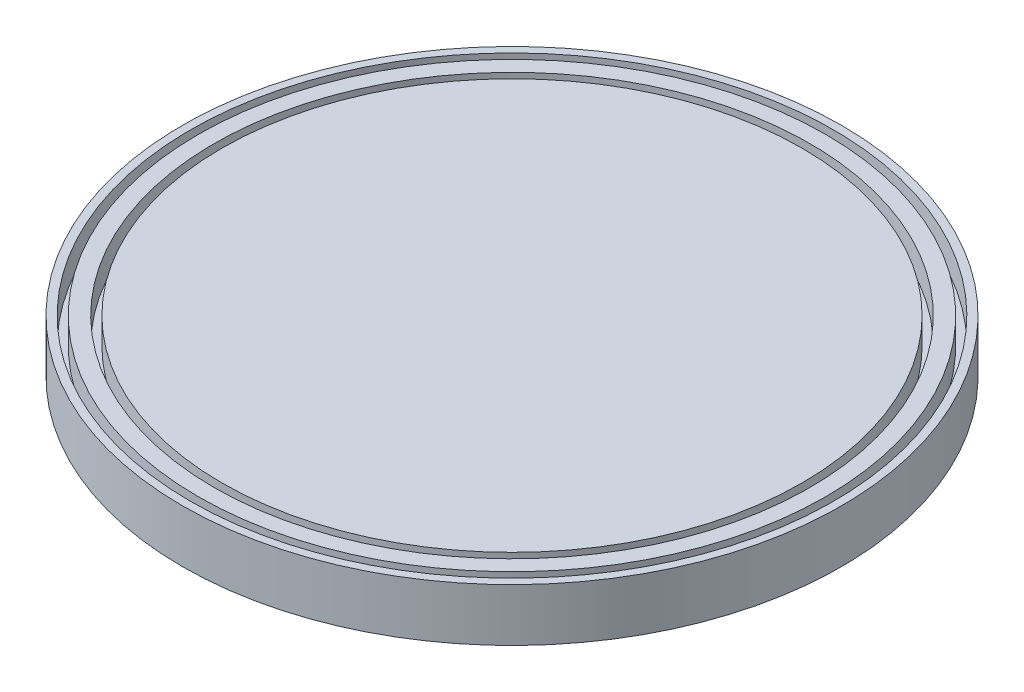
ISO-10303-21;
HEADER;
FILE_DESCRIPTION(('STEP AP214'),'2;1');
FILE_NAME('part.step','',(''),(''),'','','');
FILE_SCHEMA(('AUTOMOTIVE_DESIGN { 1 0 10303 214 1 1 1 1 }'));
ENDSEC;
DATA;
#1=APPLICATION_CONTEXT('core data for automotive mechanical design processes');
#2=APPLICATION_PROTOCOL_DEFINITION('international standard','automotive_design',2000,#1);
#3=PRODUCT_CONTEXT('',#1,'mechanical');
#4=PRODUCT('Part','Part','',(#3));
#5=PRODUCT_RELATED_PRODUCT_CATEGORY('part','',(#4));
#6=PRODUCT_DEFINITION_FORMATION('','',#4);
#7=PRODUCT_DEFINITION_CONTEXT('part definition',#1,'design');
#8=PRODUCT_DEFINITION('design','',#6,#7);
#9=PRODUCT_DEFINITION_SHAPE('','',#8);
#10=(LENGTH_UNIT() NAMED_UNIT(*) SI_UNIT(.MILLI.,.METRE.));
#11=(NAMED_UNIT(*) PLANE_ANGLE_UNIT() SI_UNIT($,.RADIAN.));
#12=(NAMED_UNIT(*) SI_UNIT($,.STERADIAN.) SOLID_ANGLE_UNIT());
#13=UNCERTAINTY_MEASURE_WITH_UNIT(LENGTH_MEASURE(1.E-05),#10,'distance_accuracy_value','');
#14=(GEOMETRIC_REPRESENTATION_CONTEXT(3) GLOBAL_UNCERTAINTY_ASSIGNED_CONTEXT((#13)) GLOBAL_UNIT_ASSIGNED_CONTEXT((#10,
#11,#12)) REPRESENTATION_CONTEXT('',''));
#15=CARTESIAN_POINT('',(0.,0.,0.));
#16=DIRECTION('',(0.,0.,1.));
#17=DIRECTION('',(1.,0.,0.));
#18=AXIS2_PLACEMENT_3D('',#15,#16,#17);
#19=CARTESIAN_POINT('',(0.,10.,0.));
#20=DIRECTION('',(0.,-1.,0.));
#21=DIRECTION('',(0.,0.,-1.));
#22=AXIS2_PLACEMENT_3D('',#19,#20,#21);
#23=CYLINDRICAL_SURFACE('',#22,62.5);
#24=CARTESIAN_POINT('',(0.,10.,0.));
#25=DIRECTION('',(0.,1.,0.));
#26=DIRECTION('',(0.,0.,1.));
#27=AXIS2_PLACEMENT_3D('',#24,#25,#26);
#28=CIRCLE('',#27,62.5);
#29=CARTESIAN_POINT('',(0.,10.,62.5));
#30=VERTEX_POINT('',#29);
#31=EDGE_CURVE('E11',#30,#30,#28,.T.);
#32=ORIENTED_EDGE('',*,*,#31,.F.);
#33=EDGE_LOOP('',(#32));
#34=FACE_BOUND('',#33,.T.);
#35=CARTESIAN_POINT('',(0.,0.,0.));
#36=DIRECTION('',(0.,1.,0.));
#37=DIRECTION('',(0.,0.,1.));
#38=AXIS2_PLACEMENT_3D('',#35,#36,#37);
#39=CIRCLE('',#38,62.5);
#40=CARTESIAN_POINT('',(0.,0.,62.5));
#41=VERTEX_POINT('',#40);
#42=EDGE_CURVE('E42',#41,#41,#39,.T.);
#43=ORIENTED_EDGE('',*,*,#42,.T.);
#44=EDGE_LOOP('',(#43));
#45=FACE_BOUND('',#44,.T.);
#46=ADVANCED_FACE('F39',(#34,#45),#23,.T.);
#47=CARTESIAN_POINT('',(0.,10.,0.));
#48=DIRECTION('',(0.,1.,0.));
#49=DIRECTION('',(0.,0.,1.));
#50=AXIS2_PLACEMENT_3D('',#47,#48,#49);
#51=PLANE('',#50);
#52=CARTESIAN_POINT('',(0.,10.,0.));
#53=DIRECTION('',(0.,1.,0.));
#54=DIRECTION('',(0.,0.,1.));
#55=AXIS2_PLACEMENT_3D('',#52,#53,#54);
#56=CIRCLE('',#55,61.);
#57=CARTESIAN_POINT('',(0.,10.,61.));
#58=VERTEX_POINT('',#57);
#59=EDGE_CURVE('E63',#58,#58,#56,.T.);
#60=ORIENTED_EDGE('',*,*,#59,.F.);
#61=EDGE_LOOP('',(#60));
#62=FACE_BOUND('',#61,.T.);
#63=ORIENTED_EDGE('',*,*,#31,.T.);
#64=EDGE_LOOP('',(#63));
#65=FACE_BOUND('',#64,.T.);
#66=ADVANCED_FACE('F91',(#62,#65),#51,.T.);
#67=CARTESIAN_POINT('',(0.,0.,0.));
#68=DIRECTION('',(0.,1.,0.));
#69=DIRECTION('',(0.,0.,1.));
#70=AXIS2_PLACEMENT_3D('',#67,#68,#69);
#71=PLANE('',#70);
#72=ORIENTED_EDGE('',*,*,#42,.F.);
#73=EDGE_LOOP('',(#72));
#74=FACE_BOUND('',#73,.T.);
#75=ADVANCED_FACE('F93',(#74),#71,.F.);
#76=CARTESIAN_POINT('',(0.,5.,0.));
#77=DIRECTION('',(0.,1.,0.));
#78=DIRECTION('',(0.,0.,1.));
#79=AXIS2_PLACEMENT_3D('',#76,#77,#78);
#80=CYLINDRICAL_SURFACE('',#79,59.5);
#81=CARTESIAN_POINT('',(0.,5.,0.));
#82=DIRECTION('',(0.,1.,0.));
#83=DIRECTION('',(0.,0.,1.));
#84=AXIS2_PLACEMENT_3D('',#81,#82,#83);
#85=CIRCLE('',#84,59.5);
#86=CARTESIAN_POINT('',(0.,5.,59.5));
#87=VERTEX_POINT('',#86);
#88=EDGE_CURVE('E66',#87,#87,#85,.T.);
#89=ORIENTED_EDGE('',*,*,#88,.T.);
#90=EDGE_LOOP('',(#89));
#91=FACE_BOUND('',#90,.T.);
#92=CARTESIAN_POINT('',(0.,10.,0.));
#93=DIRECTION('',(0.,1.,0.));
#94=DIRECTION('',(0.,0.,1.));
#95=AXIS2_PLACEMENT_3D('',#92,#93,#94);
#96=CIRCLE('',#95,59.5);
#97=CARTESIAN_POINT('',(0.,10.,59.5));
#98=VERTEX_POINT('',#97);
#99=EDGE_CURVE('E67',#98,#98,#96,.T.);
#100=ORIENTED_EDGE('',*,*,#99,.F.);
#101=EDGE_LOOP('',(#100));
#102=FACE_BOUND('',#101,.T.);
#103=ADVANCED_FACE('F75',(#91,#102),#80,.T.);
#104=CARTESIAN_POINT('',(0.,5.,0.));
#105=DIRECTION('',(0.,1.,0.));
#106=DIRECTION('',(0.,0.,1.));
#107=AXIS2_PLACEMENT_3D('',#104,#105,#106);
#108=CYLINDRICAL_SURFACE('',#107,61.);
#109=CARTESIAN_POINT('',(0.,5.,0.));
#110=DIRECTION('',(0.,1.,0.));
#111=DIRECTION('',(0.,0.,1.));
#112=AXIS2_PLACEMENT_3D('',#109,#110,#111);
#113=CIRCLE('',#112,61.);
#114=CARTESIAN_POINT('',(0.,5.,61.));
#115=VERTEX_POINT('',#114);
#116=EDGE_CURVE('E58',#115,#115,#113,.T.);
#117=ORIENTED_EDGE('',*,*,#116,.F.);
#118=EDGE_LOOP('',(#117));
#119=FACE_BOUND('',#118,.T.);
#120=ORIENTED_EDGE('',*,*,#59,.T.);
#121=EDGE_LOOP('',(#120));
#122=FACE_BOUND('',#121,.T.);
#123=ADVANCED_FACE('F82',(#119,#122),#108,.F.);
#124=CARTESIAN_POINT('',(0.,5.,0.));
#125=DIRECTION('',(0.,1.,0.));
#126=DIRECTION('',(0.,0.,1.));
#127=AXIS2_PLACEMENT_3D('',#124,#125,#126);
#128=PLANE('',#127);
#129=ORIENTED_EDGE('',*,*,#88,.F.);
#130=EDGE_LOOP('',(#129));
#131=FACE_BOUND('',#130,.T.);
#132=ORIENTED_EDGE('',*,*,#116,.T.);
#133=EDGE_LOOP('',(#132));
#134=FACE_BOUND('',#133,.T.);
#135=ADVANCED_FACE('F78',(#131,#134),#128,.T.);
#136=CARTESIAN_POINT('',(0.,10.,0.));
#137=DIRECTION('',(0.,1.,0.));
#138=DIRECTION('',(0.,0.,1.));
#139=AXIS2_PLACEMENT_3D('',#136,#137,#138);
#140=CIRCLE('',#139,56.5);
#141=CARTESIAN_POINT('',(0.,10.,56.5));
#142=VERTEX_POINT('',#141);
#143=EDGE_CURVE('E51',#142,#142,#140,.T.);
#144=ORIENTED_EDGE('',*,*,#143,.F.);
#145=EDGE_LOOP('',(#144));
#146=FACE_BOUND('',#145,.T.);
#147=ORIENTED_EDGE('',*,*,#99,.T.);
#148=EDGE_LOOP('',(#147));
#149=FACE_BOUND('',#148,.T.);
#150=ADVANCED_FACE('F81',(#146,#149),#51,.T.);
#151=CARTESIAN_POINT('',(0.,5.,0.));
#152=DIRECTION('',(0.,1.,0.));
#153=DIRECTION('',(0.,0.,1.));
#154=AXIS2_PLACEMENT_3D('',#151,#152,#153);
#155=CYLINDRICAL_SURFACE('',#154,55.);
#156=CARTESIAN_POINT('',(0.,5.,0.));
#157=DIRECTION('',(0.,1.,0.));
#158=DIRECTION('',(0.,0.,1.));
#159=AXIS2_PLACEMENT_3D('',#156,#157,#158);
#160=CIRCLE('',#159,55.);
#161=CARTESIAN_POINT('',(0.,5.,55.));
#162=VERTEX_POINT('',#161);
#163=EDGE_CURVE('E54',#162,#162,#160,.T.);
#164=ORIENTED_EDGE('',*,*,#163,.T.);
#165=EDGE_LOOP('',(#164));
#166=FACE_BOUND('',#165,.T.);
#167=CARTESIAN_POINT('',(0.,10.,0.));
#168=DIRECTION('',(0.,1.,0.));
#169=DIRECTION('',(0.,0.,1.));
#170=AXIS2_PLACEMENT_3D('',#167,#168,#169);
#171=CIRCLE('',#170,55.);
#172=CARTESIAN_POINT('',(0.,10.,55.));
#173=VERTEX_POINT('',#172);
#174=EDGE_CURVE('E55',#173,#173,#171,.T.);
#175=ORIENTED_EDGE('',*,*,#174,.F.);
#176=EDGE_LOOP('',(#175));
#177=FACE_BOUND('',#176,.T.);
#178=ADVANCED_FACE('F104',(#166,#177),#155,.T.);
#179=CARTESIAN_POINT('',(0.,5.,0.));
#180=DIRECTION('',(0.,1.,0.));
#181=DIRECTION('',(0.,0.,1.));
#182=AXIS2_PLACEMENT_3D('',#179,#180,#181);
#183=CYLINDRICAL_SURFACE('',#182,56.5);
#184=CARTESIAN_POINT('',(0.,5.,0.));
#185=DIRECTION('',(0.,1.,0.));
#186=DIRECTION('',(0.,0.,1.));
#187=AXIS2_PLACEMENT_3D('',#184,#185,#186);
#188=CIRCLE('',#187,56.5);
#189=CARTESIAN_POINT('',(0.,5.,56.5));
#190=VERTEX_POINT('',#189);
#191=EDGE_CURVE('E49',#190,#190,#188,.T.);
#192=ORIENTED_EDGE('',*,*,#191,.F.);
#193=EDGE_LOOP('',(#192));
#194=FACE_BOUND('',#193,.T.);
#195=ORIENTED_EDGE('',*,*,#143,.T.);
#196=EDGE_LOOP('',(#195));
#197=FACE_BOUND('',#196,.T.);
#198=ADVANCED_FACE('F112',(#194,#197),#183,.F.);
#199=CARTESIAN_POINT('',(0.,5.,0.));
#200=DIRECTION('',(0.,1.,0.));
#201=DIRECTION('',(0.,0.,1.));
#202=AXIS2_PLACEMENT_3D('',#199,#200,#201);
#203=PLANE('',#202);
#204=ORIENTED_EDGE('',*,*,#163,.F.);
#205=EDGE_LOOP('',(#204));
#206=FACE_BOUND('',#205,.T.);
#207=ORIENTED_EDGE('',*,*,#191,.T.);
#208=EDGE_LOOP('',(#207));
#209=FACE_BOUND('',#208,.T.);
#210=ADVANCED_FACE('F107',(#206,#209),#203,.T.);
#211=ORIENTED_EDGE('',*,*,#174,.T.);
#212=EDGE_LOOP('',(#211));
#213=FACE_BOUND('',#212,.T.);
#214=ADVANCED_FACE('F95',(#213),#51,.T.);
#215=CLOSED_SHELL('',(#46,#66,#75,#103,#123,#135,#150,#178,#198,#210,#214));
#216=MANIFOLD_SOLID_BREP('B2',#215);
#217=ADVANCED_BREP_SHAPE_REPRESENTATION('',(#18,#216),#14);
#218=SHAPE_DEFINITION_REPRESENTATION(#9,#217);
ENDSEC;
END-ISO-10303-21;
